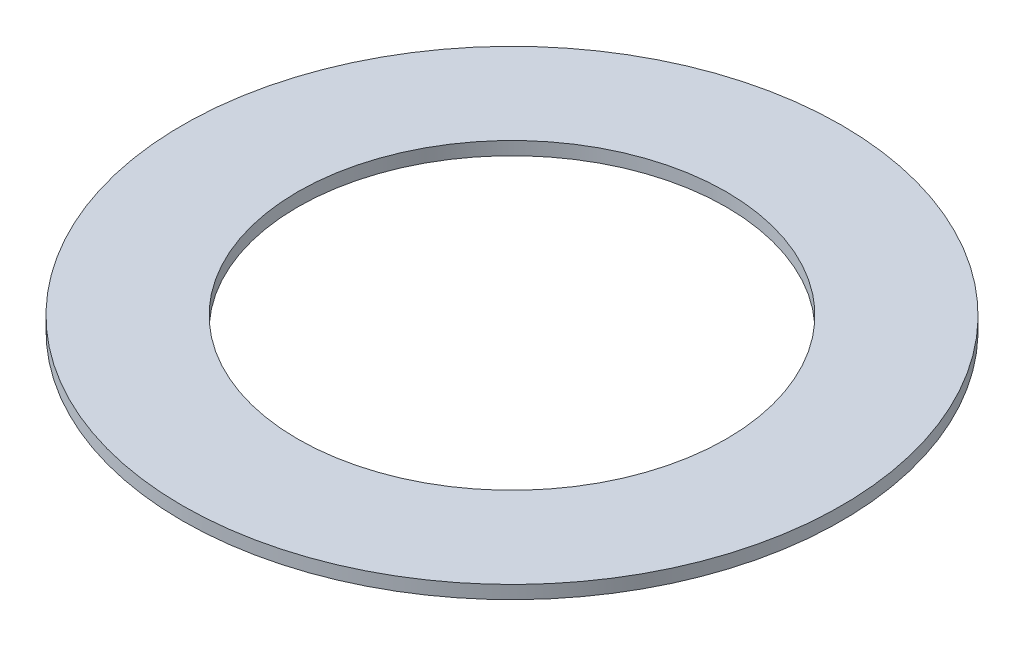
ISO-10303-21;
HEADER;
FILE_DESCRIPTION(('STEP AP214'),'2;1');
FILE_NAME('part.step','',(''),(''),'','','');
FILE_SCHEMA(('AUTOMOTIVE_DESIGN { 1 0 10303 214 1 1 1 1 }'));
ENDSEC;
DATA;
#1=APPLICATION_CONTEXT('core data for automotive mechanical design processes');
#2=APPLICATION_PROTOCOL_DEFINITION('international standard','automotive_design',2000,#1);
#3=PRODUCT_CONTEXT('',#1,'mechanical');
#4=PRODUCT('Part','Part','',(#3));
#5=PRODUCT_RELATED_PRODUCT_CATEGORY('part','',(#4));
#6=PRODUCT_DEFINITION_FORMATION('','',#4);
#7=PRODUCT_DEFINITION_CONTEXT('part definition',#1,'design');
#8=PRODUCT_DEFINITION('design','',#6,#7);
#9=PRODUCT_DEFINITION_SHAPE('','',#8);
#10=(LENGTH_UNIT() NAMED_UNIT(*) SI_UNIT(.MILLI.,.METRE.));
#11=(NAMED_UNIT(*) PLANE_ANGLE_UNIT() SI_UNIT($,.RADIAN.));
#12=(NAMED_UNIT(*) SI_UNIT($,.STERADIAN.) SOLID_ANGLE_UNIT());
#13=UNCERTAINTY_MEASURE_WITH_UNIT(LENGTH_MEASURE(1.E-05),#10,'distance_accuracy_value','');
#14=(GEOMETRIC_REPRESENTATION_CONTEXT(3) GLOBAL_UNCERTAINTY_ASSIGNED_CONTEXT((#13)) GLOBAL_UNIT_ASSIGNED_CONTEXT((#10,
#11,#12)) REPRESENTATION_CONTEXT('',''));
#15=CARTESIAN_POINT('',(0.,0.,0.));
#16=DIRECTION('',(0.,0.,1.));
#17=DIRECTION('',(1.,0.,0.));
#18=AXIS2_PLACEMENT_3D('',#15,#16,#17);
#19=CARTESIAN_POINT('',(0.,0.4,0.));
#20=DIRECTION('',(0.,1.,0.));
#21=DIRECTION('',(0.,0.,1.));
#22=AXIS2_PLACEMENT_3D('',#19,#20,#21);
#23=PLANE('',#22);
#24=CARTESIAN_POINT('',(0.,0.4,0.));
#25=DIRECTION('',(0.,1.,0.));
#26=DIRECTION('',(0.,0.,1.));
#27=AXIS2_PLACEMENT_3D('',#24,#25,#26);
#28=CIRCLE('',#27,10.);
#29=CARTESIAN_POINT('',(0.,0.4,10.));
#30=VERTEX_POINT('',#29);
#31=EDGE_CURVE('E10',#30,#30,#28,.T.);
#32=ORIENTED_EDGE('',*,*,#31,.T.);
#33=EDGE_LOOP('',(#32));
#34=FACE_BOUND('',#33,.T.);
#35=CARTESIAN_POINT('',(0.,0.4,0.));
#36=DIRECTION('',(0.,1.,0.));
#37=DIRECTION('',(0.,0.,1.));
#38=AXIS2_PLACEMENT_3D('',#35,#36,#37);
#39=CIRCLE('',#38,6.5);
#40=CARTESIAN_POINT('',(0.,0.4,6.5));
#41=VERTEX_POINT('',#40);
#42=EDGE_CURVE('E46',#41,#41,#39,.T.);
#43=ORIENTED_EDGE('',*,*,#42,.F.);
#44=EDGE_LOOP('',(#43));
#45=FACE_BOUND('',#44,.T.);
#46=ADVANCED_FACE('F35',(#34,#45),#23,.T.);
#47=CARTESIAN_POINT('',(0.,0.,0.));
#48=DIRECTION('',(0.,1.,0.));
#49=DIRECTION('',(0.,0.,1.));
#50=AXIS2_PLACEMENT_3D('',#47,#48,#49);
#51=PLANE('',#50);
#52=CARTESIAN_POINT('',(0.,0.,0.));
#53=DIRECTION('',(0.,1.,0.));
#54=DIRECTION('',(0.,0.,1.));
#55=AXIS2_PLACEMENT_3D('',#52,#53,#54);
#56=CIRCLE('',#55,10.);
#57=CARTESIAN_POINT('',(0.,0.,10.));
#58=VERTEX_POINT('',#57);
#59=EDGE_CURVE('E39',#58,#58,#56,.T.);
#60=ORIENTED_EDGE('',*,*,#59,.F.);
#61=EDGE_LOOP('',(#60));
#62=FACE_BOUND('',#61,.T.);
#63=CARTESIAN_POINT('',(0.,0.,0.));
#64=DIRECTION('',(0.,1.,0.));
#65=DIRECTION('',(0.,0.,1.));
#66=AXIS2_PLACEMENT_3D('',#63,#64,#65);
#67=CIRCLE('',#66,6.5);
#68=CARTESIAN_POINT('',(0.,0.,6.5));
#69=VERTEX_POINT('',#68);
#70=EDGE_CURVE('E48',#69,#69,#67,.T.);
#71=ORIENTED_EDGE('',*,*,#70,.T.);
#72=EDGE_LOOP('',(#71));
#73=FACE_BOUND('',#72,.T.);
#74=ADVANCED_FACE('F58',(#62,#73),#51,.F.);
#75=CARTESIAN_POINT('',(0.,0.4,0.));
#76=DIRECTION('',(0.,-1.,0.));
#77=DIRECTION('',(0.,0.,-1.));
#78=AXIS2_PLACEMENT_3D('',#75,#76,#77);
#79=CYLINDRICAL_SURFACE('',#78,10.);
#80=ORIENTED_EDGE('',*,*,#31,.F.);
#81=EDGE_LOOP('',(#80));
#82=FACE_BOUND('',#81,.T.);
#83=ORIENTED_EDGE('',*,*,#59,.T.);
#84=EDGE_LOOP('',(#83));
#85=FACE_BOUND('',#84,.T.);
#86=ADVANCED_FACE('F37',(#82,#85),#79,.T.);
#87=CARTESIAN_POINT('',(0.,0.4,0.));
#88=DIRECTION('',(0.,-1.,0.));
#89=DIRECTION('',(0.,0.,-1.));
#90=AXIS2_PLACEMENT_3D('',#87,#88,#89);
#91=CYLINDRICAL_SURFACE('',#90,6.5);
#92=ORIENTED_EDGE('',*,*,#42,.T.);
#93=EDGE_LOOP('',(#92));
#94=FACE_BOUND('',#93,.T.);
#95=ORIENTED_EDGE('',*,*,#70,.F.);
#96=EDGE_LOOP('',(#95));
#97=FACE_BOUND('',#96,.T.);
#98=ADVANCED_FACE('F54',(#94,#97),#91,.F.);
#99=CLOSED_SHELL('',(#46,#74,#86,#98));
#100=MANIFOLD_SOLID_BREP('B2',#99);
#101=ADVANCED_BREP_SHAPE_REPRESENTATION('',(#18,#100),#14);
#102=SHAPE_DEFINITION_REPRESENTATION(#9,#101);
ENDSEC;
END-ISO-10303-21;
